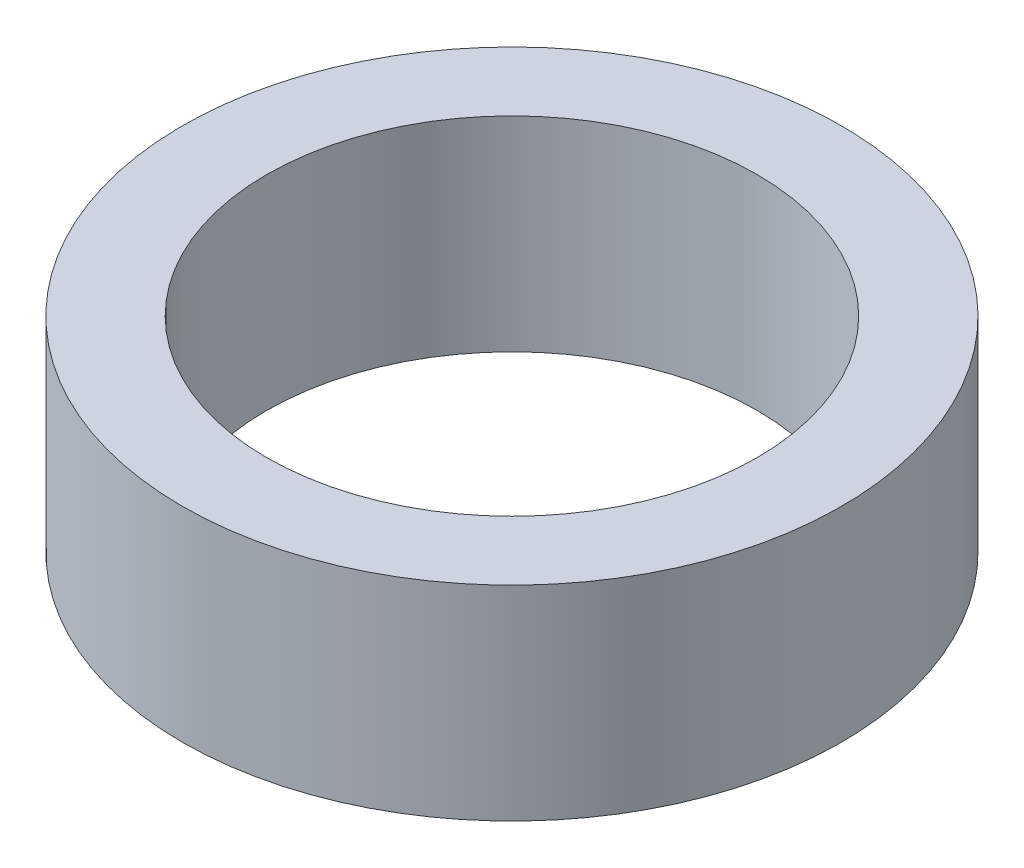
ISO-10303-21;
HEADER;
FILE_DESCRIPTION(('STEP AP214'),'2;1');
FILE_NAME('part.step','',(''),(''),'','','');
FILE_SCHEMA(('AUTOMOTIVE_DESIGN { 1 0 10303 214 1 1 1 1 }'));
ENDSEC;
DATA;
#1=APPLICATION_CONTEXT('core data for automotive mechanical design processes');
#2=APPLICATION_PROTOCOL_DEFINITION('international standard','automotive_design',2000,#1);
#3=PRODUCT_CONTEXT('',#1,'mechanical');
#4=PRODUCT('Part','Part','',(#3));
#5=PRODUCT_RELATED_PRODUCT_CATEGORY('part','',(#4));
#6=PRODUCT_DEFINITION_FORMATION('','',#4);
#7=PRODUCT_DEFINITION_CONTEXT('part definition',#1,'design');
#8=PRODUCT_DEFINITION('design','',#6,#7);
#9=PRODUCT_DEFINITION_SHAPE('','',#8);
#10=(LENGTH_UNIT() NAMED_UNIT(*) SI_UNIT(.MILLI.,.METRE.));
#11=(NAMED_UNIT(*) PLANE_ANGLE_UNIT() SI_UNIT($,.RADIAN.));
#12=(NAMED_UNIT(*) SI_UNIT($,.STERADIAN.) SOLID_ANGLE_UNIT());
#13=UNCERTAINTY_MEASURE_WITH_UNIT(LENGTH_MEASURE(1.E-05),#10,'distance_accuracy_value','');
#14=(GEOMETRIC_REPRESENTATION_CONTEXT(3) GLOBAL_UNCERTAINTY_ASSIGNED_CONTEXT((#13)) GLOBAL_UNIT_ASSIGNED_CONTEXT((#10,
#11,#12)) REPRESENTATION_CONTEXT('',''));
#15=CARTESIAN_POINT('',(0.,0.,0.));
#16=DIRECTION('',(0.,0.,1.));
#17=DIRECTION('',(1.,0.,0.));
#18=AXIS2_PLACEMENT_3D('',#15,#16,#17);
#19=CARTESIAN_POINT('',(0.,7.874,0.));
#20=DIRECTION('',(0.,1.,0.));
#21=DIRECTION('',(0.,0.,1.));
#22=AXIS2_PLACEMENT_3D('',#19,#20,#21);
#23=PLANE('',#22);
#24=CARTESIAN_POINT('',(0.,7.874,0.));
#25=DIRECTION('',(0.,1.,0.));
#26=DIRECTION('',(0.,0.,1.));
#27=AXIS2_PLACEMENT_3D('',#24,#25,#26);
#28=CIRCLE('',#27,12.7);
#29=CARTESIAN_POINT('',(0.,7.874,12.7));
#30=VERTEX_POINT('',#29);
#31=EDGE_CURVE('E10',#30,#30,#28,.T.);
#32=ORIENTED_EDGE('',*,*,#31,.T.);
#33=EDGE_LOOP('',(#32));
#34=FACE_BOUND('',#33,.T.);
#35=CARTESIAN_POINT('',(0.,7.874,0.));
#36=DIRECTION('',(0.,1.,0.));
#37=DIRECTION('',(0.,0.,1.));
#38=AXIS2_PLACEMENT_3D('',#35,#36,#37);
#39=CIRCLE('',#38,9.4488);
#40=CARTESIAN_POINT('',(0.,7.874,9.4488));
#41=VERTEX_POINT('',#40);
#42=EDGE_CURVE('E48',#41,#41,#39,.T.);
#43=ORIENTED_EDGE('',*,*,#42,.F.);
#44=EDGE_LOOP('',(#43));
#45=FACE_BOUND('',#44,.T.);
#46=ADVANCED_FACE('F37',(#34,#45),#23,.T.);
#47=CARTESIAN_POINT('',(0.,0.,0.));
#48=DIRECTION('',(0.,1.,0.));
#49=DIRECTION('',(0.,0.,1.));
#50=AXIS2_PLACEMENT_3D('',#47,#48,#49);
#51=PLANE('',#50);
#52=CARTESIAN_POINT('',(0.,0.,0.));
#53=DIRECTION('',(0.,1.,0.));
#54=DIRECTION('',(0.,0.,1.));
#55=AXIS2_PLACEMENT_3D('',#52,#53,#54);
#56=CIRCLE('',#55,12.7);
#57=CARTESIAN_POINT('',(0.,0.,12.7));
#58=VERTEX_POINT('',#57);
#59=EDGE_CURVE('E41',#58,#58,#56,.T.);
#60=ORIENTED_EDGE('',*,*,#59,.F.);
#61=EDGE_LOOP('',(#60));
#62=FACE_BOUND('',#61,.T.);
#63=CARTESIAN_POINT('',(0.,0.,0.));
#64=DIRECTION('',(0.,1.,0.));
#65=DIRECTION('',(0.,0.,1.));
#66=AXIS2_PLACEMENT_3D('',#63,#64,#65);
#67=CIRCLE('',#66,9.4488);
#68=CARTESIAN_POINT('',(0.,0.,9.4488));
#69=VERTEX_POINT('',#68);
#70=EDGE_CURVE('E50',#69,#69,#67,.T.);
#71=ORIENTED_EDGE('',*,*,#70,.T.);
#72=EDGE_LOOP('',(#71));
#73=FACE_BOUND('',#72,.T.);
#74=ADVANCED_FACE('F60',(#62,#73),#51,.F.);
#75=CARTESIAN_POINT('',(0.,7.874,0.));
#76=DIRECTION('',(0.,-1.,0.));
#77=DIRECTION('',(0.,0.,-1.));
#78=AXIS2_PLACEMENT_3D('',#75,#76,#77);
#79=CYLINDRICAL_SURFACE('',#78,12.7);
#80=ORIENTED_EDGE('',*,*,#31,.F.);
#81=EDGE_LOOP('',(#80));
#82=FACE_BOUND('',#81,.T.);
#83=ORIENTED_EDGE('',*,*,#59,.T.);
#84=EDGE_LOOP('',(#83));
#85=FACE_BOUND('',#84,.T.);
#86=ADVANCED_FACE('F39',(#82,#85),#79,.T.);
#87=CARTESIAN_POINT('',(0.,7.874,0.));
#88=DIRECTION('',(0.,-1.,0.));
#89=DIRECTION('',(0.,0.,-1.));
#90=AXIS2_PLACEMENT_3D('',#87,#88,#89);
#91=CYLINDRICAL_SURFACE('',#90,9.4488);
#92=ORIENTED_EDGE('',*,*,#42,.T.);
#93=EDGE_LOOP('',(#92));
#94=FACE_BOUND('',#93,.T.);
#95=ORIENTED_EDGE('',*,*,#70,.F.);
#96=EDGE_LOOP('',(#95));
#97=FACE_BOUND('',#96,.T.);
#98=ADVANCED_FACE('F56',(#94,#97),#91,.F.);
#99=CLOSED_SHELL('',(#46,#74,#86,#98));
#100=MANIFOLD_SOLID_BREP('B2',#99);
#101=ADVANCED_BREP_SHAPE_REPRESENTATION('',(#18,#100),#14);
#102=SHAPE_DEFINITION_REPRESENTATION(#9,#101);
ENDSEC;
END-ISO-10303-21;
